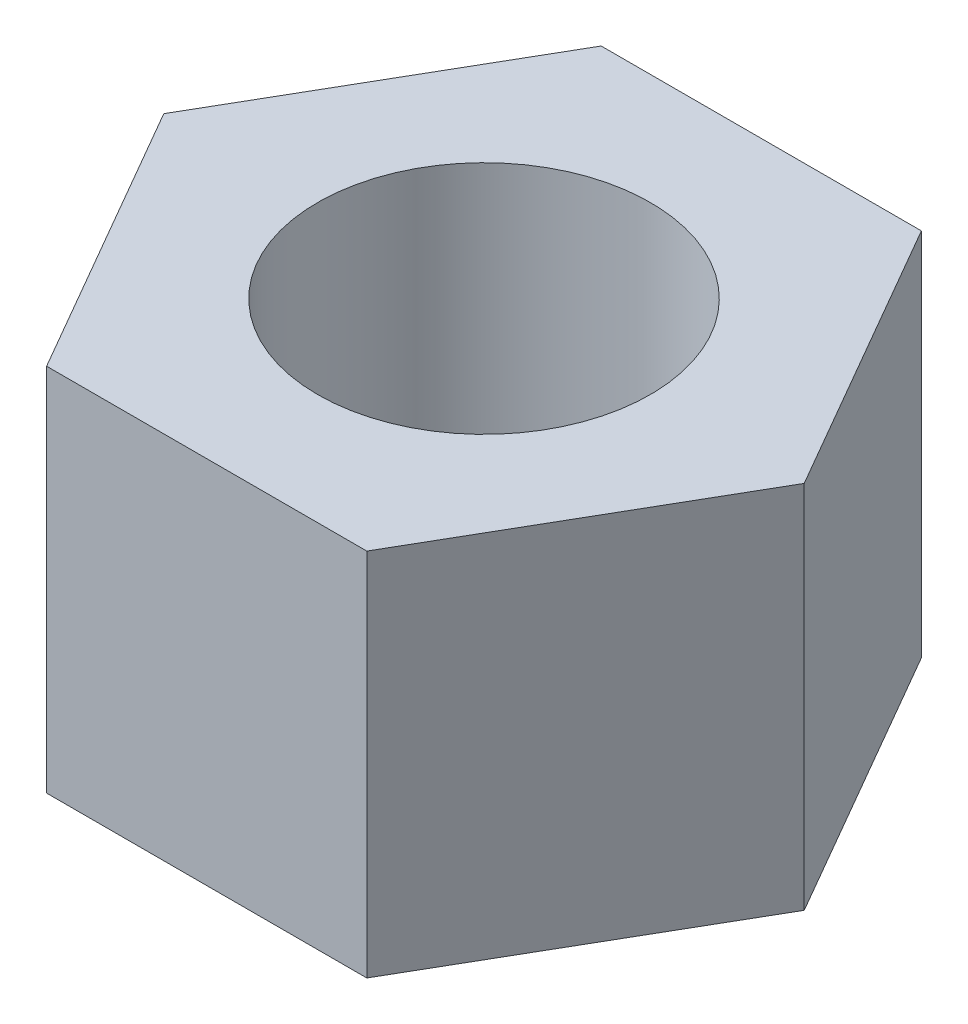
ISO-10303-21;
HEADER;
FILE_DESCRIPTION(('STEP AP214'),'2;1');
FILE_NAME('part.step','',(''),(''),'','','');
FILE_SCHEMA(('AUTOMOTIVE_DESIGN { 1 0 10303 214 1 1 1 1 }'));
ENDSEC;
DATA;
#1=APPLICATION_CONTEXT('core data for automotive mechanical design processes');
#2=APPLICATION_PROTOCOL_DEFINITION('international standard','automotive_design',2000,#1);
#3=PRODUCT_CONTEXT('',#1,'mechanical');
#4=PRODUCT('Part','Part','',(#3));
#5=PRODUCT_RELATED_PRODUCT_CATEGORY('part','',(#4));
#6=PRODUCT_DEFINITION_FORMATION('','',#4);
#7=PRODUCT_DEFINITION_CONTEXT('part definition',#1,'design');
#8=PRODUCT_DEFINITION('design','',#6,#7);
#9=PRODUCT_DEFINITION_SHAPE('','',#8);
#10=(LENGTH_UNIT() NAMED_UNIT(*) SI_UNIT(.MILLI.,.METRE.));
#11=(NAMED_UNIT(*) PLANE_ANGLE_UNIT() SI_UNIT($,.RADIAN.));
#12=(NAMED_UNIT(*) SI_UNIT($,.STERADIAN.) SOLID_ANGLE_UNIT());
#13=UNCERTAINTY_MEASURE_WITH_UNIT(LENGTH_MEASURE(1.E-05),#10,'distance_accuracy_value','');
#14=(GEOMETRIC_REPRESENTATION_CONTEXT(3) GLOBAL_UNCERTAINTY_ASSIGNED_CONTEXT((#13)) GLOBAL_UNIT_ASSIGNED_CONTEXT((#10,
#11,#12)) REPRESENTATION_CONTEXT('',''));
#15=CARTESIAN_POINT('',(0.,0.,0.));
#16=DIRECTION('',(0.,0.,1.));
#17=DIRECTION('',(1.,0.,0.));
#18=AXIS2_PLACEMENT_3D('',#15,#16,#17);
#19=CARTESIAN_POINT('',(0.,1.5,0.));
#20=DIRECTION('',(0.,1.,0.));
#21=DIRECTION('',(0.,0.,1.));
#22=AXIS2_PLACEMENT_3D('',#19,#20,#21);
#23=PLANE('',#22);
#24=DIRECTION('',(-0.5,0.,-0.866025403784439));
#25=VECTOR('',#24,1.);
#26=CARTESIAN_POINT('',(2.59807621135332,1.5,0.));
#27=LINE('',#26,#25);
#28=CARTESIAN_POINT('',(2.59807621135332,1.5,0.));
#29=VERTEX_POINT('',#28);
#30=CARTESIAN_POINT('',(1.29903810567666,1.5,-2.25));
#31=VERTEX_POINT('',#30);
#32=EDGE_CURVE('E146',#29,#31,#27,.T.);
#33=ORIENTED_EDGE('',*,*,#32,.T.);
#34=DIRECTION('',(-1.,0.,0.));
#35=VECTOR('',#34,1.);
#36=CARTESIAN_POINT('',(1.29903810567666,1.5,-2.25));
#37=LINE('',#36,#35);
#38=CARTESIAN_POINT('',(-1.29903810567666,1.5,-2.25));
#39=VERTEX_POINT('',#38);
#40=EDGE_CURVE('E94',#31,#39,#37,.T.);
#41=ORIENTED_EDGE('',*,*,#40,.T.);
#42=DIRECTION('',(-0.5,0.,0.866025403784439));
#43=VECTOR('',#42,1.);
#44=CARTESIAN_POINT('',(-1.29903810567666,1.5,-2.25));
#45=LINE('',#44,#43);
#46=CARTESIAN_POINT('',(-2.59807621135332,1.5,0.));
#47=VERTEX_POINT('',#46);
#48=EDGE_CURVE('E107',#39,#47,#45,.T.);
#49=ORIENTED_EDGE('',*,*,#48,.T.);
#50=DIRECTION('',(0.5,0.,0.866025403784439));
#51=VECTOR('',#50,1.);
#52=CARTESIAN_POINT('',(-2.59807621135332,1.5,0.));
#53=LINE('',#52,#51);
#54=CARTESIAN_POINT('',(-1.29903810567666,1.5,2.25));
#55=VERTEX_POINT('',#54);
#56=EDGE_CURVE('E101',#47,#55,#53,.T.);
#57=ORIENTED_EDGE('',*,*,#56,.T.);
#58=DIRECTION('',(1.,0.,0.));
#59=VECTOR('',#58,1.);
#60=CARTESIAN_POINT('',(-1.29903810567666,1.5,2.25));
#61=LINE('',#60,#59);
#62=CARTESIAN_POINT('',(1.29903810567666,1.5,2.25));
#63=VERTEX_POINT('',#62);
#64=EDGE_CURVE('E105',#55,#63,#61,.T.);
#65=ORIENTED_EDGE('',*,*,#64,.T.);
#66=DIRECTION('',(0.5,0.,-0.866025403784439));
#67=VECTOR('',#66,1.);
#68=CARTESIAN_POINT('',(1.29903810567666,1.5,2.25));
#69=LINE('',#68,#67);
#70=EDGE_CURVE('E57',#63,#29,#69,.T.);
#71=ORIENTED_EDGE('',*,*,#70,.T.);
#72=EDGE_LOOP('',(#33,#41,#49,#57,#65,#71));
#73=FACE_BOUND('',#72,.T.);
#74=CARTESIAN_POINT('',(0.,1.5,0.));
#75=DIRECTION('',(0.,1.,0.));
#76=DIRECTION('',(0.,0.,1.));
#77=AXIS2_PLACEMENT_3D('',#74,#75,#76);
#78=CIRCLE('',#77,1.35);
#79=CARTESIAN_POINT('',(0.,1.5,1.35));
#80=VERTEX_POINT('',#79);
#81=EDGE_CURVE('E134',#80,#80,#78,.T.);
#82=ORIENTED_EDGE('',*,*,#81,.F.);
#83=EDGE_LOOP('',(#82));
#84=FACE_BOUND('',#83,.T.);
#85=ADVANCED_FACE('F39',(#73,#84),#23,.T.);
#86=CARTESIAN_POINT('',(0.,-1.5,0.));
#87=DIRECTION('',(0.,1.,0.));
#88=DIRECTION('',(0.,0.,1.));
#89=AXIS2_PLACEMENT_3D('',#86,#87,#88);
#90=PLANE('',#89);
#91=DIRECTION('',(-0.5,0.,-0.866025403784439));
#92=VECTOR('',#91,1.);
#93=CARTESIAN_POINT('',(2.59807621135332,-1.5,0.));
#94=LINE('',#93,#92);
#95=CARTESIAN_POINT('',(2.59807621135332,-1.5,0.));
#96=VERTEX_POINT('',#95);
#97=CARTESIAN_POINT('',(1.29903810567666,-1.5,-2.25));
#98=VERTEX_POINT('',#97);
#99=EDGE_CURVE('E129',#96,#98,#94,.T.);
#100=ORIENTED_EDGE('',*,*,#99,.F.);
#101=DIRECTION('',(0.5,0.,-0.866025403784439));
#102=VECTOR('',#101,1.);
#103=CARTESIAN_POINT('',(1.29903810567666,-1.5,2.25));
#104=LINE('',#103,#102);
#105=CARTESIAN_POINT('',(1.29903810567666,-1.5,2.25));
#106=VERTEX_POINT('',#105);
#107=EDGE_CURVE('E86',#106,#96,#104,.T.);
#108=ORIENTED_EDGE('',*,*,#107,.F.);
#109=DIRECTION('',(1.,0.,0.));
#110=VECTOR('',#109,1.);
#111=CARTESIAN_POINT('',(-1.29903810567666,-1.5,2.25));
#112=LINE('',#111,#110);
#113=CARTESIAN_POINT('',(-1.29903810567666,-1.5,2.25));
#114=VERTEX_POINT('',#113);
#115=EDGE_CURVE('E80',#114,#106,#112,.T.);
#116=ORIENTED_EDGE('',*,*,#115,.F.);
#117=DIRECTION('',(0.5,0.,0.866025403784439));
#118=VECTOR('',#117,1.);
#119=CARTESIAN_POINT('',(-2.59807621135332,-1.5,0.));
#120=LINE('',#119,#118);
#121=CARTESIAN_POINT('',(-2.59807621135332,-1.5,0.));
#122=VERTEX_POINT('',#121);
#123=EDGE_CURVE('E116',#122,#114,#120,.T.);
#124=ORIENTED_EDGE('',*,*,#123,.F.);
#125=DIRECTION('',(-0.5,0.,0.866025403784439));
#126=VECTOR('',#125,1.);
#127=CARTESIAN_POINT('',(-1.29903810567666,-1.5,-2.25));
#128=LINE('',#127,#126);
#129=CARTESIAN_POINT('',(-1.29903810567666,-1.5,-2.25));
#130=VERTEX_POINT('',#129);
#131=EDGE_CURVE('E137',#130,#122,#128,.T.);
#132=ORIENTED_EDGE('',*,*,#131,.F.);
#133=DIRECTION('',(-1.,0.,0.));
#134=VECTOR('',#133,1.);
#135=CARTESIAN_POINT('',(1.29903810567666,-1.5,-2.25));
#136=LINE('',#135,#134);
#137=EDGE_CURVE('E133',#98,#130,#136,.T.);
#138=ORIENTED_EDGE('',*,*,#137,.F.);
#139=EDGE_LOOP('',(#100,#108,#116,#124,#132,#138));
#140=FACE_BOUND('',#139,.T.);
#141=CARTESIAN_POINT('',(0.,-1.5,0.));
#142=DIRECTION('',(0.,1.,0.));
#143=DIRECTION('',(0.,0.,1.));
#144=AXIS2_PLACEMENT_3D('',#141,#142,#143);
#145=CIRCLE('',#144,1.35);
#146=CARTESIAN_POINT('',(0.,-1.5,1.35));
#147=VERTEX_POINT('',#146);
#148=EDGE_CURVE('E243',#147,#147,#145,.T.);
#149=ORIENTED_EDGE('',*,*,#148,.T.);
#150=EDGE_LOOP('',(#149));
#151=FACE_BOUND('',#150,.T.);
#152=ADVANCED_FACE('F159',(#140,#151),#90,.F.);
#153=CARTESIAN_POINT('',(2.59807621135332,1.5,0.));
#154=DIRECTION('',(-0.866025403784438,0.,0.5));
#155=DIRECTION('',(0.5,0.,0.866025403784439));
#156=AXIS2_PLACEMENT_3D('',#153,#154,#155);
#157=PLANE('',#156);
#158=ORIENTED_EDGE('',*,*,#99,.T.);
#159=DIRECTION('',(0.,-1.,0.));
#160=VECTOR('',#159,1.);
#161=CARTESIAN_POINT('',(1.29903810567666,1.5,-2.25));
#162=LINE('',#161,#160);
#163=EDGE_CURVE('E11',#31,#98,#162,.T.);
#164=ORIENTED_EDGE('',*,*,#163,.F.);
#165=ORIENTED_EDGE('',*,*,#32,.F.);
#166=DIRECTION('',(0.,-1.,0.));
#167=VECTOR('',#166,1.);
#168=CARTESIAN_POINT('',(2.59807621135332,1.5,0.));
#169=LINE('',#168,#167);
#170=EDGE_CURVE('E125',#29,#96,#169,.T.);
#171=ORIENTED_EDGE('',*,*,#170,.T.);
#172=EDGE_LOOP('',(#158,#164,#165,#171));
#173=FACE_BOUND('',#172,.T.);
#174=ADVANCED_FACE('F41',(#173),#157,.F.);
#175=CARTESIAN_POINT('',(1.29903810567666,1.5,-2.25));
#176=DIRECTION('',(0.,0.,1.));
#177=DIRECTION('',(1.,0.,0.));
#178=AXIS2_PLACEMENT_3D('',#175,#176,#177);
#179=PLANE('',#178);
#180=ORIENTED_EDGE('',*,*,#137,.T.);
#181=DIRECTION('',(0.,-1.,0.));
#182=VECTOR('',#181,1.);
#183=CARTESIAN_POINT('',(-1.29903810567666,1.5,-2.25));
#184=LINE('',#183,#182);
#185=EDGE_CURVE('E49',#39,#130,#184,.T.);
#186=ORIENTED_EDGE('',*,*,#185,.F.);
#187=ORIENTED_EDGE('',*,*,#40,.F.);
#188=ORIENTED_EDGE('',*,*,#163,.T.);
#189=EDGE_LOOP('',(#180,#186,#187,#188));
#190=FACE_BOUND('',#189,.T.);
#191=ADVANCED_FACE('F184',(#190),#179,.F.);
#192=CARTESIAN_POINT('',(-1.29903810567666,1.5,-2.25));
#193=DIRECTION('',(0.866025403784439,0.,0.5));
#194=DIRECTION('',(0.5,0.,-0.866025403784439));
#195=AXIS2_PLACEMENT_3D('',#192,#193,#194);
#196=PLANE('',#195);
#197=ORIENTED_EDGE('',*,*,#131,.T.);
#198=DIRECTION('',(0.,-1.,0.));
#199=VECTOR('',#198,1.);
#200=CARTESIAN_POINT('',(-2.59807621135332,1.5,0.));
#201=LINE('',#200,#199);
#202=EDGE_CURVE('E118',#47,#122,#201,.T.);
#203=ORIENTED_EDGE('',*,*,#202,.F.);
#204=ORIENTED_EDGE('',*,*,#48,.F.);
#205=ORIENTED_EDGE('',*,*,#185,.T.);
#206=EDGE_LOOP('',(#197,#203,#204,#205));
#207=FACE_BOUND('',#206,.T.);
#208=ADVANCED_FACE('F156',(#207),#196,.F.);
#209=CARTESIAN_POINT('',(-2.59807621135332,1.5,0.));
#210=DIRECTION('',(0.866025403784439,0.,-0.5));
#211=DIRECTION('',(-0.5,0.,-0.866025403784439));
#212=AXIS2_PLACEMENT_3D('',#209,#210,#211);
#213=PLANE('',#212);
#214=ORIENTED_EDGE('',*,*,#123,.T.);
#215=DIRECTION('',(0.,-1.,0.));
#216=VECTOR('',#215,1.);
#217=CARTESIAN_POINT('',(-1.29903810567666,1.5,2.25));
#218=LINE('',#217,#216);
#219=EDGE_CURVE('E113',#55,#114,#218,.T.);
#220=ORIENTED_EDGE('',*,*,#219,.F.);
#221=ORIENTED_EDGE('',*,*,#56,.F.);
#222=ORIENTED_EDGE('',*,*,#202,.T.);
#223=EDGE_LOOP('',(#214,#220,#221,#222));
#224=FACE_BOUND('',#223,.T.);
#225=ADVANCED_FACE('F114',(#224),#213,.F.);
#226=CARTESIAN_POINT('',(-1.29903810567666,1.5,2.25));
#227=DIRECTION('',(0.,0.,-1.));
#228=DIRECTION('',(-1.,0.,0.));
#229=AXIS2_PLACEMENT_3D('',#226,#227,#228);
#230=PLANE('',#229);
#231=ORIENTED_EDGE('',*,*,#115,.T.);
#232=DIRECTION('',(0.,-1.,0.));
#233=VECTOR('',#232,1.);
#234=CARTESIAN_POINT('',(1.29903810567666,1.5,2.25));
#235=LINE('',#234,#233);
#236=EDGE_CURVE('E119',#63,#106,#235,.T.);
#237=ORIENTED_EDGE('',*,*,#236,.F.);
#238=ORIENTED_EDGE('',*,*,#64,.F.);
#239=ORIENTED_EDGE('',*,*,#219,.T.);
#240=EDGE_LOOP('',(#231,#237,#238,#239));
#241=FACE_BOUND('',#240,.T.);
#242=ADVANCED_FACE('F121',(#241),#230,.F.);
#243=CARTESIAN_POINT('',(1.29903810567666,1.5,2.25));
#244=DIRECTION('',(-0.866025403784438,0.,-0.5));
#245=DIRECTION('',(-0.5,0.,0.866025403784439));
#246=AXIS2_PLACEMENT_3D('',#243,#244,#245);
#247=PLANE('',#246);
#248=ORIENTED_EDGE('',*,*,#107,.T.);
#249=ORIENTED_EDGE('',*,*,#170,.F.);
#250=ORIENTED_EDGE('',*,*,#70,.F.);
#251=ORIENTED_EDGE('',*,*,#236,.T.);
#252=EDGE_LOOP('',(#248,#249,#250,#251));
#253=FACE_BOUND('',#252,.T.);
#254=ADVANCED_FACE('F164',(#253),#247,.F.);
#255=CARTESIAN_POINT('',(0.,1.5,0.));
#256=DIRECTION('',(0.,-1.,0.));
#257=DIRECTION('',(0.,0.,-1.));
#258=AXIS2_PLACEMENT_3D('',#255,#256,#257);
#259=CYLINDRICAL_SURFACE('',#258,1.35);
#260=ORIENTED_EDGE('',*,*,#81,.T.);
#261=EDGE_LOOP('',(#260));
#262=FACE_BOUND('',#261,.T.);
#263=ORIENTED_EDGE('',*,*,#148,.F.);
#264=EDGE_LOOP('',(#263));
#265=FACE_BOUND('',#264,.T.);
#266=ADVANCED_FACE('F166',(#262,#265),#259,.F.);
#267=CLOSED_SHELL('',(#85,#152,#174,#191,#208,#225,#242,#254,#266));
#268=MANIFOLD_SOLID_BREP('B2',#267);
#269=ADVANCED_BREP_SHAPE_REPRESENTATION('',(#18,#268),#14);
#270=SHAPE_DEFINITION_REPRESENTATION(#9,#269);
ENDSEC;
END-ISO-10303-21;
